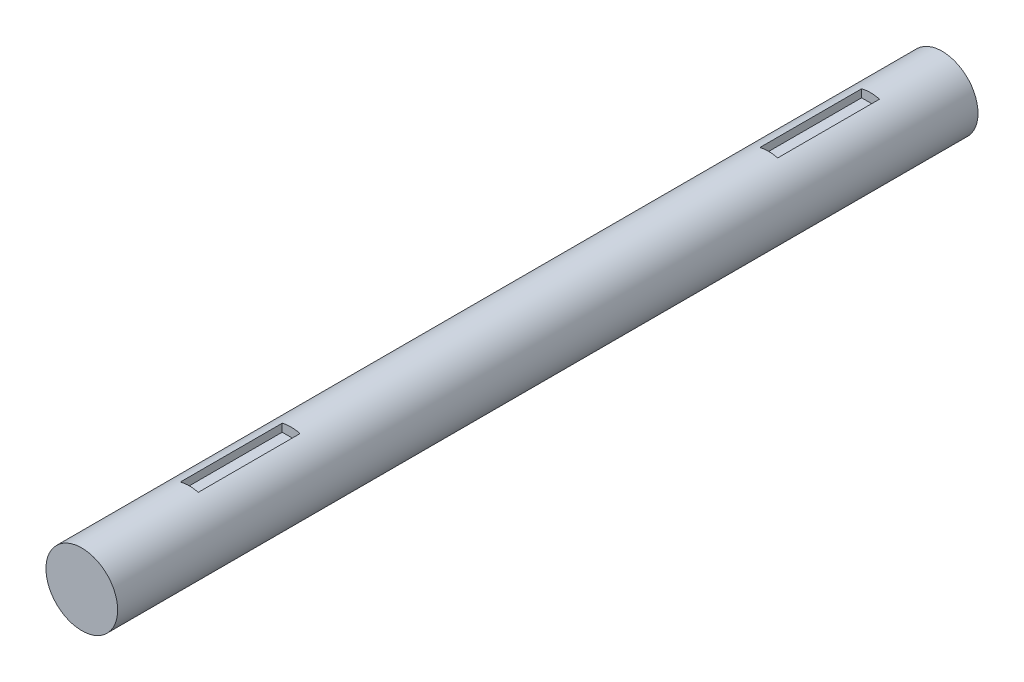
ISO-10303-21;
HEADER;
FILE_DESCRIPTION(('STEP AP214'),'2;1');
FILE_NAME('part.step','',(''),(''),'','','');
FILE_SCHEMA(('AUTOMOTIVE_DESIGN { 1 0 10303 214 1 1 1 1 }'));
ENDSEC;
DATA;
#1=APPLICATION_CONTEXT('core data for automotive mechanical design processes');
#2=APPLICATION_PROTOCOL_DEFINITION('international standard','automotive_design',2000,#1);
#3=PRODUCT_CONTEXT('',#1,'mechanical');
#4=PRODUCT('Part','Part','',(#3));
#5=PRODUCT_RELATED_PRODUCT_CATEGORY('part','',(#4));
#6=PRODUCT_DEFINITION_FORMATION('','',#4);
#7=PRODUCT_DEFINITION_CONTEXT('part definition',#1,'design');
#8=PRODUCT_DEFINITION('design','',#6,#7);
#9=PRODUCT_DEFINITION_SHAPE('','',#8);
#10=(LENGTH_UNIT() NAMED_UNIT(*) SI_UNIT(.MILLI.,.METRE.));
#11=(NAMED_UNIT(*) PLANE_ANGLE_UNIT() SI_UNIT($,.RADIAN.));
#12=(NAMED_UNIT(*) SI_UNIT($,.STERADIAN.) SOLID_ANGLE_UNIT());
#13=UNCERTAINTY_MEASURE_WITH_UNIT(LENGTH_MEASURE(1.E-05),#10,'distance_accuracy_value','');
#14=(GEOMETRIC_REPRESENTATION_CONTEXT(3) GLOBAL_UNCERTAINTY_ASSIGNED_CONTEXT((#13)) GLOBAL_UNIT_ASSIGNED_CONTEXT((#10,
#11,#12)) REPRESENTATION_CONTEXT('',''));
#15=CARTESIAN_POINT('',(0.,0.,0.));
#16=DIRECTION('',(0.,0.,1.));
#17=DIRECTION('',(1.,0.,0.));
#18=AXIS2_PLACEMENT_3D('',#15,#16,#17);
#19=CARTESIAN_POINT('',(0.,0.,152.4));
#20=DIRECTION('',(0.,0.,-1.));
#21=DIRECTION('',(-1.,0.,0.));
#22=AXIS2_PLACEMENT_3D('',#19,#20,#21);
#23=CYLINDRICAL_SURFACE('',#22,6.35);
#24=CARTESIAN_POINT('',(0.,0.,30.734));
#25=DIRECTION('',(0.,0.,-1.));
#26=DIRECTION('',(-1.,0.,0.));
#27=AXIS2_PLACEMENT_3D('',#24,#25,#26);
#28=CIRCLE('',#27,6.35);
#29=CARTESIAN_POINT('',(-1.57143332462789,6.15248708298107,30.734));
#30=VERTEX_POINT('',#29);
#31=CARTESIAN_POINT('',(1.60356667537211,6.1441902572785,30.734));
#32=VERTEX_POINT('',#31);
#33=EDGE_CURVE('E161',#30,#32,#28,.T.);
#34=ORIENTED_EDGE('',*,*,#33,.F.);
#35=DIRECTION('',(0.,0.,-1.));
#36=VECTOR('',#35,1.);
#37=CARTESIAN_POINT('',(-1.57143332462789,6.15248708298107,152.4));
#38=LINE('',#37,#36);
#39=CARTESIAN_POINT('',(-1.57143332462789,6.15248708298107,12.7));
#40=VERTEX_POINT('',#39);
#41=EDGE_CURVE('E155',#30,#40,#38,.T.);
#42=ORIENTED_EDGE('',*,*,#41,.T.);
#43=CARTESIAN_POINT('',(0.,0.,12.7));
#44=DIRECTION('',(0.,0.,-1.));
#45=DIRECTION('',(-1.,0.,0.));
#46=AXIS2_PLACEMENT_3D('',#43,#44,#45);
#47=CIRCLE('',#46,6.35);
#48=CARTESIAN_POINT('',(1.60356667537211,6.1441902572785,12.7));
#49=VERTEX_POINT('',#48);
#50=EDGE_CURVE('E150',#40,#49,#47,.T.);
#51=ORIENTED_EDGE('',*,*,#50,.T.);
#52=DIRECTION('',(0.,0.,-1.));
#53=VECTOR('',#52,1.);
#54=CARTESIAN_POINT('',(1.60356667537211,6.1441902572785,152.4));
#55=LINE('',#54,#53);
#56=EDGE_CURVE('E158',#49,#32,#55,.F.);
#57=ORIENTED_EDGE('',*,*,#56,.T.);
#58=EDGE_LOOP('',(#34,#42,#51,#57));
#59=FACE_BOUND('',#58,.T.);
#60=CARTESIAN_POINT('',(0.,0.,152.4));
#61=DIRECTION('',(0.,0.,1.));
#62=DIRECTION('',(1.,0.,0.));
#63=AXIS2_PLACEMENT_3D('',#60,#61,#62);
#64=CIRCLE('',#63,6.35);
#65=CARTESIAN_POINT('',(6.35,0.,152.4));
#66=VERTEX_POINT('',#65);
#67=EDGE_CURVE('E147',#66,#66,#64,.T.);
#68=ORIENTED_EDGE('',*,*,#67,.F.);
#69=EDGE_LOOP('',(#68));
#70=FACE_BOUND('',#69,.T.);
#71=CARTESIAN_POINT('',(0.,0.,0.));
#72=DIRECTION('',(0.,0.,1.));
#73=DIRECTION('',(1.,0.,0.));
#74=AXIS2_PLACEMENT_3D('',#71,#72,#73);
#75=CIRCLE('',#74,6.35);
#76=CARTESIAN_POINT('',(6.35,0.,0.));
#77=VERTEX_POINT('',#76);
#78=EDGE_CURVE('E145',#77,#77,#75,.T.);
#79=ORIENTED_EDGE('',*,*,#78,.T.);
#80=EDGE_LOOP('',(#79));
#81=FACE_BOUND('',#80,.T.);
#82=CARTESIAN_POINT('',(0.,0.,115.316));
#83=DIRECTION('',(0.,0.,1.));
#84=DIRECTION('',(1.,0.,0.));
#85=AXIS2_PLACEMENT_3D('',#82,#83,#84);
#86=CIRCLE('',#85,6.35);
#87=CARTESIAN_POINT('',(1.5875,6.14836106210427,115.316));
#88=VERTEX_POINT('',#87);
#89=CARTESIAN_POINT('',(-1.5875,6.14836106210428,115.316));
#90=VERTEX_POINT('',#89);
#91=EDGE_CURVE('E11',#88,#90,#86,.T.);
#92=ORIENTED_EDGE('',*,*,#91,.F.);
#93=DIRECTION('',(0.,0.,-1.));
#94=VECTOR('',#93,1.);
#95=CARTESIAN_POINT('',(1.5875,6.14836106210427,152.4));
#96=LINE('',#95,#94);
#97=CARTESIAN_POINT('',(1.5875,6.14836106210427,133.35));
#98=VERTEX_POINT('',#97);
#99=EDGE_CURVE('E112',#88,#98,#96,.F.);
#100=ORIENTED_EDGE('',*,*,#99,.T.);
#101=CARTESIAN_POINT('',(0.,0.,133.35));
#102=DIRECTION('',(0.,0.,1.));
#103=DIRECTION('',(1.,0.,0.));
#104=AXIS2_PLACEMENT_3D('',#101,#102,#103);
#105=CIRCLE('',#104,6.35);
#106=CARTESIAN_POINT('',(-1.5875,6.14836106210428,133.35));
#107=VERTEX_POINT('',#106);
#108=EDGE_CURVE('E163',#98,#107,#105,.T.);
#109=ORIENTED_EDGE('',*,*,#108,.T.);
#110=DIRECTION('',(0.,0.,-1.));
#111=VECTOR('',#110,1.);
#112=CARTESIAN_POINT('',(-1.5875,6.14836106210427,152.4));
#113=LINE('',#112,#111);
#114=EDGE_CURVE('E39',#107,#90,#113,.T.);
#115=ORIENTED_EDGE('',*,*,#114,.T.);
#116=EDGE_LOOP('',(#92,#100,#109,#115));
#117=FACE_BOUND('',#116,.T.);
#118=ADVANCED_FACE('F32',(#59,#70,#81,#117),#23,.T.);
#119=CARTESIAN_POINT('',(0.,0.,152.4));
#120=DIRECTION('',(0.,0.,1.));
#121=DIRECTION('',(1.,0.,0.));
#122=AXIS2_PLACEMENT_3D('',#119,#120,#121);
#123=PLANE('',#122);
#124=ORIENTED_EDGE('',*,*,#67,.T.);
#125=EDGE_LOOP('',(#124));
#126=FACE_BOUND('',#125,.T.);
#127=ADVANCED_FACE('F181',(#126),#123,.T.);
#128=CARTESIAN_POINT('',(0.,0.,0.));
#129=DIRECTION('',(0.,0.,1.));
#130=DIRECTION('',(1.,0.,0.));
#131=AXIS2_PLACEMENT_3D('',#128,#129,#130);
#132=PLANE('',#131);
#133=ORIENTED_EDGE('',*,*,#78,.F.);
#134=EDGE_LOOP('',(#133));
#135=FACE_BOUND('',#134,.T.);
#136=ADVANCED_FACE('F188',(#135),#132,.F.);
#137=CARTESIAN_POINT('',(1.60356667537211,7.9375,30.734));
#138=DIRECTION('',(1.,0.,0.));
#139=DIRECTION('',(0.,1.,0.));
#140=AXIS2_PLACEMENT_3D('',#137,#138,#139);
#141=PLANE('',#140);
#142=DIRECTION('',(0.,-1.,0.));
#143=VECTOR('',#142,1.);
#144=CARTESIAN_POINT('',(1.60356667537211,7.9375,12.7));
#145=LINE('',#144,#143);
#146=CARTESIAN_POINT('',(1.60356667537211,4.7625,12.7));
#147=VERTEX_POINT('',#146);
#148=EDGE_CURVE('E54',#49,#147,#145,.T.);
#149=ORIENTED_EDGE('',*,*,#148,.T.);
#150=DIRECTION('',(0.,0.,-1.));
#151=VECTOR('',#150,1.);
#152=CARTESIAN_POINT('',(1.60356667537211,4.7625,30.734));
#153=LINE('',#152,#151);
#154=CARTESIAN_POINT('',(1.60356667537211,4.7625,30.734));
#155=VERTEX_POINT('',#154);
#156=EDGE_CURVE('E142',#155,#147,#153,.T.);
#157=ORIENTED_EDGE('',*,*,#156,.F.);
#158=DIRECTION('',(0.,-1.,0.));
#159=VECTOR('',#158,1.);
#160=CARTESIAN_POINT('',(1.60356667537211,7.9375,30.734));
#161=LINE('',#160,#159);
#162=EDGE_CURVE('E133',#32,#155,#161,.T.);
#163=ORIENTED_EDGE('',*,*,#162,.F.);
#164=ORIENTED_EDGE('',*,*,#56,.F.);
#165=EDGE_LOOP('',(#149,#157,#163,#164));
#166=FACE_BOUND('',#165,.T.);
#167=ADVANCED_FACE('F198',(#166),#141,.F.);
#168=CARTESIAN_POINT('',(-1.57143332462789,4.7625,30.734));
#169=DIRECTION('',(-1.,0.,0.));
#170=DIRECTION('',(0.,0.,1.));
#171=AXIS2_PLACEMENT_3D('',#168,#169,#170);
#172=PLANE('',#171);
#173=DIRECTION('',(0.,1.,0.));
#174=VECTOR('',#173,1.);
#175=CARTESIAN_POINT('',(-1.57143332462789,4.7625,30.734));
#176=LINE('',#175,#174);
#177=CARTESIAN_POINT('',(-1.57143332462789,4.7625,30.734));
#178=VERTEX_POINT('',#177);
#179=EDGE_CURVE('E130',#178,#30,#176,.T.);
#180=ORIENTED_EDGE('',*,*,#179,.F.);
#181=DIRECTION('',(0.,0.,-1.));
#182=VECTOR('',#181,1.);
#183=CARTESIAN_POINT('',(-1.57143332462789,4.7625,30.734));
#184=LINE('',#183,#182);
#185=CARTESIAN_POINT('',(-1.57143332462789,4.7625,12.7));
#186=VERTEX_POINT('',#185);
#187=EDGE_CURVE('E135',#178,#186,#184,.T.);
#188=ORIENTED_EDGE('',*,*,#187,.T.);
#189=DIRECTION('',(0.,1.,0.));
#190=VECTOR('',#189,1.);
#191=CARTESIAN_POINT('',(-1.57143332462789,4.7625,12.7));
#192=LINE('',#191,#190);
#193=EDGE_CURVE('E138',#186,#40,#192,.T.);
#194=ORIENTED_EDGE('',*,*,#193,.T.);
#195=ORIENTED_EDGE('',*,*,#41,.F.);
#196=EDGE_LOOP('',(#180,#188,#194,#195));
#197=FACE_BOUND('',#196,.T.);
#198=ADVANCED_FACE('F202',(#197),#172,.F.);
#199=CARTESIAN_POINT('',(0.,0.,30.734));
#200=DIRECTION('',(0.,0.,-1.));
#201=DIRECTION('',(-1.,0.,0.));
#202=AXIS2_PLACEMENT_3D('',#199,#200,#201);
#203=PLANE('',#202);
#204=ORIENTED_EDGE('',*,*,#33,.T.);
#205=ORIENTED_EDGE('',*,*,#162,.T.);
#206=DIRECTION('',(-1.,0.,0.));
#207=VECTOR('',#206,1.);
#208=CARTESIAN_POINT('',(0.0160666753721095,4.7625,30.734));
#209=LINE('',#208,#207);
#210=EDGE_CURVE('E128',#155,#178,#209,.T.);
#211=ORIENTED_EDGE('',*,*,#210,.T.);
#212=ORIENTED_EDGE('',*,*,#179,.T.);
#213=EDGE_LOOP('',(#204,#205,#211,#212));
#214=FACE_BOUND('',#213,.T.);
#215=ADVANCED_FACE('F212',(#214),#203,.T.);
#216=CARTESIAN_POINT('',(0.,0.,12.7));
#217=DIRECTION('',(0.,0.,-1.));
#218=DIRECTION('',(-1.,0.,0.));
#219=AXIS2_PLACEMENT_3D('',#216,#217,#218);
#220=PLANE('',#219);
#221=ORIENTED_EDGE('',*,*,#193,.F.);
#222=DIRECTION('',(-1.,0.,0.));
#223=VECTOR('',#222,1.);
#224=CARTESIAN_POINT('',(-1.57143332462789,4.7625,12.7));
#225=LINE('',#224,#223);
#226=EDGE_CURVE('E126',#147,#186,#225,.T.);
#227=ORIENTED_EDGE('',*,*,#226,.F.);
#228=ORIENTED_EDGE('',*,*,#148,.F.);
#229=ORIENTED_EDGE('',*,*,#50,.F.);
#230=EDGE_LOOP('',(#221,#227,#228,#229));
#231=FACE_BOUND('',#230,.T.);
#232=ADVANCED_FACE('F209',(#231),#220,.F.);
#233=CARTESIAN_POINT('',(-1.57143332462789,4.7625,30.734));
#234=DIRECTION('',(0.,-1.,0.));
#235=DIRECTION('',(1.,0.,0.));
#236=AXIS2_PLACEMENT_3D('',#233,#234,#235);
#237=PLANE('',#236);
#238=ORIENTED_EDGE('',*,*,#226,.T.);
#239=ORIENTED_EDGE('',*,*,#187,.F.);
#240=ORIENTED_EDGE('',*,*,#210,.F.);
#241=ORIENTED_EDGE('',*,*,#156,.T.);
#242=EDGE_LOOP('',(#238,#239,#240,#241));
#243=FACE_BOUND('',#242,.T.);
#244=ADVANCED_FACE('F206',(#243),#237,.F.);
#245=CARTESIAN_POINT('',(-1.5875,0.,115.316));
#246=DIRECTION('',(-1.,0.,0.));
#247=DIRECTION('',(0.,-1.,0.));
#248=AXIS2_PLACEMENT_3D('',#245,#246,#247);
#249=PLANE('',#248);
#250=DIRECTION('',(0.,-1.,0.));
#251=VECTOR('',#250,1.);
#252=CARTESIAN_POINT('',(-1.5875,0.,133.35));
#253=LINE('',#252,#251);
#254=CARTESIAN_POINT('',(-1.5875,4.7625,133.35));
#255=VERTEX_POINT('',#254);
#256=EDGE_CURVE('E46',#107,#255,#253,.T.);
#257=ORIENTED_EDGE('',*,*,#256,.T.);
#258=DIRECTION('',(0.,0.,1.));
#259=VECTOR('',#258,1.);
#260=CARTESIAN_POINT('',(-1.5875,4.7625,115.316));
#261=LINE('',#260,#259);
#262=CARTESIAN_POINT('',(-1.5875,4.7625,115.316));
#263=VERTEX_POINT('',#262);
#264=EDGE_CURVE('E105',#263,#255,#261,.T.);
#265=ORIENTED_EDGE('',*,*,#264,.F.);
#266=DIRECTION('',(0.,-1.,0.));
#267=VECTOR('',#266,1.);
#268=CARTESIAN_POINT('',(-1.5875,0.,115.316));
#269=LINE('',#268,#267);
#270=EDGE_CURVE('E106',#90,#263,#269,.T.);
#271=ORIENTED_EDGE('',*,*,#270,.F.);
#272=ORIENTED_EDGE('',*,*,#114,.F.);
#273=EDGE_LOOP('',(#257,#265,#271,#272));
#274=FACE_BOUND('',#273,.T.);
#275=ADVANCED_FACE('F169',(#274),#249,.F.);
#276=CARTESIAN_POINT('',(1.5875,0.,115.316));
#277=DIRECTION('',(1.,0.,0.));
#278=DIRECTION('',(0.,0.,-1.));
#279=AXIS2_PLACEMENT_3D('',#276,#277,#278);
#280=PLANE('',#279);
#281=DIRECTION('',(0.,1.,0.));
#282=VECTOR('',#281,1.);
#283=CARTESIAN_POINT('',(1.5875,0.,115.316));
#284=LINE('',#283,#282);
#285=CARTESIAN_POINT('',(1.5875,4.7625,115.316));
#286=VERTEX_POINT('',#285);
#287=EDGE_CURVE('E109',#286,#88,#284,.T.);
#288=ORIENTED_EDGE('',*,*,#287,.F.);
#289=DIRECTION('',(0.,0.,1.));
#290=VECTOR('',#289,1.);
#291=CARTESIAN_POINT('',(1.5875,4.7625,115.316));
#292=LINE('',#291,#290);
#293=CARTESIAN_POINT('',(1.5875,4.7625,133.35));
#294=VERTEX_POINT('',#293);
#295=EDGE_CURVE('E95',#286,#294,#292,.T.);
#296=ORIENTED_EDGE('',*,*,#295,.T.);
#297=DIRECTION('',(0.,1.,0.));
#298=VECTOR('',#297,1.);
#299=CARTESIAN_POINT('',(1.5875,0.,133.35));
#300=LINE('',#299,#298);
#301=EDGE_CURVE('E120',#294,#98,#300,.T.);
#302=ORIENTED_EDGE('',*,*,#301,.T.);
#303=ORIENTED_EDGE('',*,*,#99,.F.);
#304=EDGE_LOOP('',(#288,#296,#302,#303));
#305=FACE_BOUND('',#304,.T.);
#306=ADVANCED_FACE('F110',(#305),#280,.F.);
#307=CARTESIAN_POINT('',(0.,0.,115.316));
#308=DIRECTION('',(0.,0.,1.));
#309=DIRECTION('',(1.,0.,0.));
#310=AXIS2_PLACEMENT_3D('',#307,#308,#309);
#311=PLANE('',#310);
#312=ORIENTED_EDGE('',*,*,#91,.T.);
#313=ORIENTED_EDGE('',*,*,#270,.T.);
#314=DIRECTION('',(1.,0.,0.));
#315=VECTOR('',#314,1.);
#316=CARTESIAN_POINT('',(0.,4.7625,115.316));
#317=LINE('',#316,#315);
#318=EDGE_CURVE('E100',#263,#286,#317,.T.);
#319=ORIENTED_EDGE('',*,*,#318,.T.);
#320=ORIENTED_EDGE('',*,*,#287,.T.);
#321=EDGE_LOOP('',(#312,#313,#319,#320));
#322=FACE_BOUND('',#321,.T.);
#323=ADVANCED_FACE('F116',(#322),#311,.T.);
#324=CARTESIAN_POINT('',(0.,0.,133.35));
#325=DIRECTION('',(0.,0.,1.));
#326=DIRECTION('',(1.,0.,0.));
#327=AXIS2_PLACEMENT_3D('',#324,#325,#326);
#328=PLANE('',#327);
#329=ORIENTED_EDGE('',*,*,#301,.F.);
#330=DIRECTION('',(1.,0.,0.));
#331=VECTOR('',#330,1.);
#332=CARTESIAN_POINT('',(0.,4.7625,133.35));
#333=LINE('',#332,#331);
#334=EDGE_CURVE('E101',#255,#294,#333,.T.);
#335=ORIENTED_EDGE('',*,*,#334,.F.);
#336=ORIENTED_EDGE('',*,*,#256,.F.);
#337=ORIENTED_EDGE('',*,*,#108,.F.);
#338=EDGE_LOOP('',(#329,#335,#336,#337));
#339=FACE_BOUND('',#338,.T.);
#340=ADVANCED_FACE('F170',(#339),#328,.F.);
#341=CARTESIAN_POINT('',(0.,4.7625,115.316));
#342=DIRECTION('',(0.,-1.,0.));
#343=DIRECTION('',(0.,0.,-1.));
#344=AXIS2_PLACEMENT_3D('',#341,#342,#343);
#345=PLANE('',#344);
#346=ORIENTED_EDGE('',*,*,#334,.T.);
#347=ORIENTED_EDGE('',*,*,#295,.F.);
#348=ORIENTED_EDGE('',*,*,#318,.F.);
#349=ORIENTED_EDGE('',*,*,#264,.T.);
#350=EDGE_LOOP('',(#346,#347,#348,#349));
#351=FACE_BOUND('',#350,.T.);
#352=ADVANCED_FACE('F97',(#351),#345,.F.);
#353=CLOSED_SHELL('',(#118,#127,#136,#167,#198,#215,#232,#244,#275,#306,#323,#340,#352));
#354=MANIFOLD_SOLID_BREP('B2',#353);
#355=ADVANCED_BREP_SHAPE_REPRESENTATION('',(#18,#354),#14);
#356=SHAPE_DEFINITION_REPRESENTATION(#9,#355);
ENDSEC;
END-ISO-10303-21;
